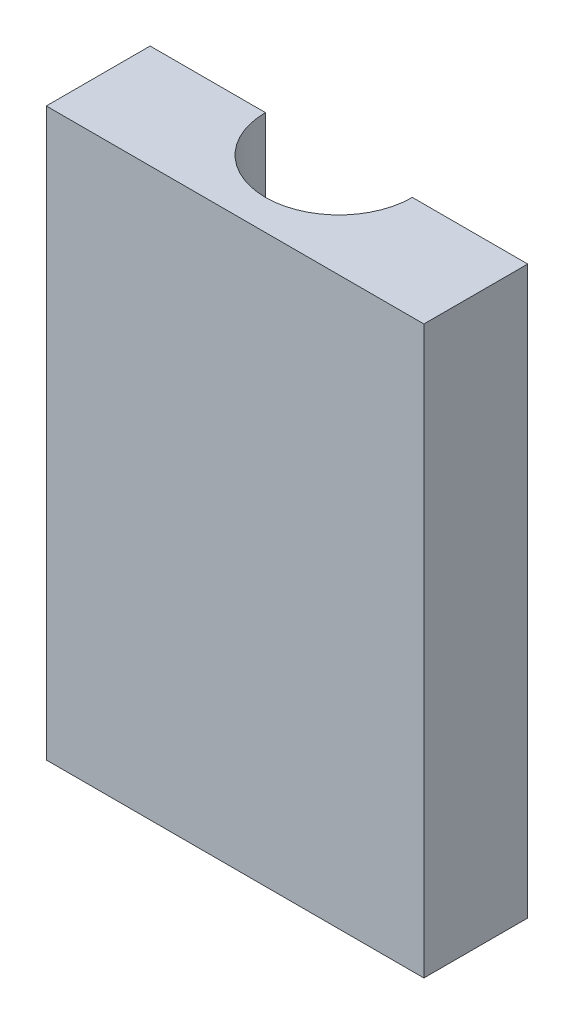
ISO-10303-21;
HEADER;
FILE_DESCRIPTION(('STEP AP214'),'2;1');
FILE_NAME('part.step','',(''),(''),'','','');
FILE_SCHEMA(('AUTOMOTIVE_DESIGN { 1 0 10303 214 1 1 1 1 }'));
ENDSEC;
DATA;
#1=APPLICATION_CONTEXT('core data for automotive mechanical design processes');
#2=APPLICATION_PROTOCOL_DEFINITION('international standard','automotive_design',2000,#1);
#3=PRODUCT_CONTEXT('',#1,'mechanical');
#4=PRODUCT('Part','Part','',(#3));
#5=PRODUCT_RELATED_PRODUCT_CATEGORY('part','',(#4));
#6=PRODUCT_DEFINITION_FORMATION('','',#4);
#7=PRODUCT_DEFINITION_CONTEXT('part definition',#1,'design');
#8=PRODUCT_DEFINITION('design','',#6,#7);
#9=PRODUCT_DEFINITION_SHAPE('','',#8);
#10=(LENGTH_UNIT() NAMED_UNIT(*) SI_UNIT(.MILLI.,.METRE.));
#11=(NAMED_UNIT(*) PLANE_ANGLE_UNIT() SI_UNIT($,.RADIAN.));
#12=(NAMED_UNIT(*) SI_UNIT($,.STERADIAN.) SOLID_ANGLE_UNIT());
#13=UNCERTAINTY_MEASURE_WITH_UNIT(LENGTH_MEASURE(1.E-05),#10,'distance_accuracy_value','');
#14=(GEOMETRIC_REPRESENTATION_CONTEXT(3) GLOBAL_UNCERTAINTY_ASSIGNED_CONTEXT((#13)) GLOBAL_UNIT_ASSIGNED_CONTEXT((#10,
#11,#12)) REPRESENTATION_CONTEXT('',''));
#15=CARTESIAN_POINT('',(0.,0.,0.));
#16=DIRECTION('',(0.,0.,1.));
#17=DIRECTION('',(1.,0.,0.));
#18=AXIS2_PLACEMENT_3D('',#15,#16,#17);
#19=CARTESIAN_POINT('',(-9.8806,12.7,0.));
#20=CARTESIAN_POINT('',(-13.5720666666667,8.46666666666667,0.));
#21=CARTESIAN_POINT('',(-17.2635333333333,4.23333333333333,0.));
#22=CARTESIAN_POINT('',(-20.955,0.,0.));
#23=CARTESIAN_POINT('',(-9.8806,12.7,-0.272662572352311));
#24=CARTESIAN_POINT('',(-13.5720666666667,8.46666666666667,-0.296844728512093));
#25=CARTESIAN_POINT('',(-17.2635333333333,4.23333333333333,-0.321026884671874));
#26=CARTESIAN_POINT('',(-20.955,0.,-0.345209040831655));
#27=CARTESIAN_POINT('',(-9.85846325723523,12.7,-0.812858202586466));
#28=CARTESIAN_POINT('',(-13.5416594698784,8.46666666666667,-0.884949739833852));
#29=CARTESIAN_POINT('',(-17.2248556825215,4.23333333333333,-0.957041277081239));
#30=CARTESIAN_POINT('',(-20.9080518951647,0.,-1.02913281432863));
#31=CARTESIAN_POINT('',(-9.76139899903792,12.7,-1.60521202028217));
#32=CARTESIAN_POINT('',(-13.4083312728858,8.46666666666667,-1.74757658249229));
#33=CARTESIAN_POINT('',(-17.0552635467338,4.23333333333333,-1.8899411447024));
#34=CARTESIAN_POINT('',(-20.7021958205817,0.,-2.03230570691252));
#35=CARTESIAN_POINT('',(-9.60302668103459,12.7,-2.3770751260782));
#36=CARTESIAN_POINT('',(-13.1907898626379,8.46666666666667,-2.58789541360956));
#37=CARTESIAN_POINT('',(-16.7785530442412,4.23333333333333,-2.79871570114091));
#38=CARTESIAN_POINT('',(-20.3663162258446,0.,-3.00953598867227));
#39=CARTESIAN_POINT('',(-8.30025091964339,12.7,-6.87000298399141));
#40=CARTESIAN_POINT('',(-11.4012872529463,8.46666666666667,-7.47929630776443));
#41=CARTESIAN_POINT('',(-14.5023235862492,4.23333333333333,-8.08858963153745));
#42=CARTESIAN_POINT('',(-17.6033599195522,0.,-8.69788295531046));
#43=CARTESIAN_POINT('',(-4.36260115763694,12.7,-9.8806));
#44=CARTESIAN_POINT('',(-5.99250184720824,8.46666666666667,-10.7569));
#45=CARTESIAN_POINT('',(-7.62240253677954,4.23333333333333,-11.6332));
#46=CARTESIAN_POINT('',(-9.25230322635084,0.,-12.5095));
#47=CARTESIAN_POINT('',(5.45325144704619,12.7,-9.8806));
#48=CARTESIAN_POINT('',(7.49062730901031,8.46666666666667,-10.7569));
#49=CARTESIAN_POINT('',(9.52800317097444,4.23333333333333,-11.6332));
#50=CARTESIAN_POINT('',(11.5653790329386,0.,-12.5095));
#51=CARTESIAN_POINT('',(9.8806,12.7,-5.45325144704618));
#52=CARTESIAN_POINT('',(13.5720666666667,8.46666666666667,-5.93689457024179));
#53=CARTESIAN_POINT('',(17.2635333333333,4.23333333333333,-6.4205376934374));
#54=CARTESIAN_POINT('',(20.955,0.,-6.90418081663301));
#55=CARTESIAN_POINT('',(9.8806,12.7,5.45325144704619));
#56=CARTESIAN_POINT('',(13.5720666666667,8.46666666666667,5.9368945702418));
#57=CARTESIAN_POINT('',(17.2635333333333,4.23333333333333,6.42053769343741));
#58=CARTESIAN_POINT('',(20.955,0.,6.90418081663303));
#59=CARTESIAN_POINT('',(5.45325144704618,12.7,9.8806));
#60=CARTESIAN_POINT('',(7.49062730901031,8.46666666666667,10.7569));
#61=CARTESIAN_POINT('',(9.52800317097443,4.23333333333333,11.6332));
#62=CARTESIAN_POINT('',(11.5653790329386,0.,12.5095));
#63=CARTESIAN_POINT('',(-4.36260115763695,12.7,9.8806));
#64=CARTESIAN_POINT('',(-5.99250184720825,8.46666666666667,10.7569));
#65=CARTESIAN_POINT('',(-7.62240253677955,4.23333333333333,11.6332));
#66=CARTESIAN_POINT('',(-9.25230322635085,0.,12.5095));
#67=CARTESIAN_POINT('',(-8.30025091964339,12.7,6.8700029839914));
#68=CARTESIAN_POINT('',(-11.4012872529463,8.46666666666667,7.47929630776442));
#69=CARTESIAN_POINT('',(-14.5023235862493,4.23333333333333,8.08858963153743));
#70=CARTESIAN_POINT('',(-17.6033599195522,0.,8.69788295531045));
#71=CARTESIAN_POINT('',(-9.60302668103459,12.7,2.37707512607819));
#72=CARTESIAN_POINT('',(-13.1907898626379,8.46666666666667,2.58789541360955));
#73=CARTESIAN_POINT('',(-16.7785530442412,4.23333333333333,2.7987157011409));
#74=CARTESIAN_POINT('',(-20.3663162258446,0.,3.00953598867226));
#75=CARTESIAN_POINT('',(-9.76139899903792,12.7,1.60521202028217));
#76=CARTESIAN_POINT('',(-13.4083312728858,8.46666666666667,1.74757658249228));
#77=CARTESIAN_POINT('',(-17.0552635467338,4.23333333333333,1.88994114470239));
#78=CARTESIAN_POINT('',(-20.7021958205817,0.,2.03230570691251));
#79=CARTESIAN_POINT('',(-9.85846325723523,12.7,0.812858202586462));
#80=CARTESIAN_POINT('',(-13.5416594698784,8.46666666666667,0.884949739833847));
#81=CARTESIAN_POINT('',(-17.2248556825215,4.23333333333333,0.957041277081232));
#82=CARTESIAN_POINT('',(-20.9080518951647,0.,1.02913281432862));
#83=CARTESIAN_POINT('',(-9.8806,12.7,0.272662572352305));
#84=CARTESIAN_POINT('',(-13.5720666666667,8.46666666666667,0.296844728512085));
#85=CARTESIAN_POINT('',(-17.2635333333333,4.23333333333333,0.321026884671864));
#86=CARTESIAN_POINT('',(-20.955,0.,0.345209040831644));
#87=CARTESIAN_POINT('',(-9.8806,12.7,0.));
#88=CARTESIAN_POINT('',(-13.5720666666667,8.46666666666667,0.));
#89=CARTESIAN_POINT('',(-17.2635333333333,4.23333333333333,0.));
#90=CARTESIAN_POINT('',(-20.955,0.,0.));
#91=B_SPLINE_SURFACE_WITH_KNOTS('',3,3,((#19,#20,#21,#22),(#23,#24,#25,#26),(#27,#28,#29,#30),
(#31,#32,#33,#34),(#35,#36,#37,#38),(#39,#40,#41,#42),(#43,#44,#45,#46),(#47,#48,#49,#50),(#51,
#52,#53,#54),(#55,#56,#57,#58),(#59,#60,#61,#62),(#63,#64,#65,#66),(#67,#68,#69,#70),(#71,#72,
#73,#74),(#75,#76,#77,#78),(#79,#80,#81,#82),(#83,#84,#85,#86),(#87,#88,#89,#90)),.UNSPECIFIED.,
.T.,.F.,.F.,(4,1,1,1,1,2,2,2,1,1,1,1,4),(4,4),(0.,0.0125,0.0249999999999999,0.0375000000000001,
0.05,0.25,0.5,0.75,0.95,0.9625,0.975,0.9875,1.),(0.,1.),.UNSPECIFIED.);
#92=CARTESIAN_POINT('',(20.955,0.,0.));
#93=CARTESIAN_POINT('',(19.1092666666667,2.11666666666666,0.));
#94=CARTESIAN_POINT('',(17.2635333333333,4.23333333333333,0.));
#95=CARTESIAN_POINT('',(13.5720666666667,8.46666666666666,0.));
#96=CARTESIAN_POINT('',(11.7263333333333,10.5833333333333,0.));
#97=CARTESIAN_POINT('',(9.8806,12.7,0.));
#98=B_SPLINE_CURVE_WITH_KNOTS('',3,(#92,#93,#94,#95,#96,#97),.UNSPECIFIED.,.F.,.F.,(4,2,4),(0.,
8.42514592395883,16.8502918479176),.UNSPECIFIED.);
#99=CARTESIAN_POINT('',(20.955,0.,0.));
#100=VERTEX_POINT('',#99);
#101=CARTESIAN_POINT('',(9.8806,12.7,0.));
#102=VERTEX_POINT('',#101);
#103=EDGE_CURVE('E166',#100,#102,#98,.T.);
#104=CARTESIAN_POINT('',(0.,0.,0.));
#105=DIRECTION('',(0.,1.,0.));
#106=DIRECTION('',(-1.,0.,0.));
#107=AXIS2_PLACEMENT_3D('',#104,#105,#106);
#108=ELLIPSE('',#107,20.955,12.5095);
#109=CARTESIAN_POINT('',(-20.955,0.,0.));
#110=VERTEX_POINT('',#109);
#111=EDGE_CURVE('E237',#110,#100,#108,.T.);
#112=DIRECTION('',(-0.657223038031152,-0.753696144531139,0.));
#113=VECTOR('',#112,1.);
#114=CARTESIAN_POINT('',(-15.4178,6.35,0.));
#115=LINE('',#114,#113);
#116=CARTESIAN_POINT('',(-9.8806,12.7,0.));
#117=VERTEX_POINT('',#116);
#118=EDGE_CURVE('E174',#117,#110,#115,.T.);
#119=CARTESIAN_POINT('',(-9.8806,12.7,0.));
#120=CARTESIAN_POINT('',(-9.8806,12.7,0.272662572352305));
#121=CARTESIAN_POINT('',(-9.85846325723523,12.7,0.812858202586462));
#122=CARTESIAN_POINT('',(-9.76139899903792,12.7,1.60521202028217));
#123=CARTESIAN_POINT('',(-9.60302668103459,12.7,2.37707512607819));
#124=CARTESIAN_POINT('',(-8.30025091964339,12.7,6.8700029839914));
#125=CARTESIAN_POINT('',(-4.36260115763695,12.7,9.8806));
#126=CARTESIAN_POINT('',(5.45325144704618,12.7,9.8806));
#127=CARTESIAN_POINT('',(9.8806,12.7,5.45325144704619));
#128=CARTESIAN_POINT('',(9.8806,12.7,-5.45325144704618));
#129=CARTESIAN_POINT('',(5.45325144704619,12.7,-9.8806));
#130=CARTESIAN_POINT('',(-4.36260115763694,12.7,-9.8806));
#131=CARTESIAN_POINT('',(-8.30025091964339,12.7,-6.87000298399141));
#132=CARTESIAN_POINT('',(-9.60302668103459,12.7,-2.3770751260782));
#133=CARTESIAN_POINT('',(-9.76139899903792,12.7,-1.60521202028217));
#134=CARTESIAN_POINT('',(-9.85846325723523,12.7,-0.812858202586466));
#135=CARTESIAN_POINT('',(-9.8806,12.7,-0.272662572352311));
#136=CARTESIAN_POINT('',(-9.8806,12.7,0.));
#137=B_SPLINE_CURVE_WITH_KNOTS('',3,(#119,#120,#121,#122,#123,#124,#125,#126,#127,#128,#129,
#130,#131,#132,#133,#134,#135,#136),.UNSPECIFIED.,.T.,.F.,(4,1,1,1,1,2,2,2,1,1,1,1,4),(0.,
0.0125,0.025,0.0375,0.05,0.25,0.5,0.75,0.95,0.9625,0.975,0.9875,1.),.UNSPECIFIED.);
#138=EDGE_CURVE('E172',#117,#102,#137,.T.);
#139=CARTESIAN_POINT('',(0.,12.7,-9.8806));
#140=CARTESIAN_POINT('',(0.,8.46666666666666,-10.7569));
#141=CARTESIAN_POINT('',(0.,4.23333333333333,-11.6332));
#142=CARTESIAN_POINT('',(0.,0.,-12.5095));
#143=CARTESIAN_POINT('',(5.45325144704619,12.7,-9.8806));
#144=CARTESIAN_POINT('',(7.49062730901031,8.46666666666667,-10.7569));
#145=CARTESIAN_POINT('',(9.52800317097444,4.23333333333333,-11.6332));
#146=CARTESIAN_POINT('',(11.5653790329386,0.,-12.5095));
#147=CARTESIAN_POINT('',(9.8806,12.7,-5.45325144704618));
#148=CARTESIAN_POINT('',(13.5720666666667,8.46666666666667,-5.93689457024179));
#149=CARTESIAN_POINT('',(17.2635333333333,4.23333333333333,-6.4205376934374));
#150=CARTESIAN_POINT('',(20.955,0.,-6.90418081663301));
#151=CARTESIAN_POINT('',(9.8806,12.7,5.45325144704619));
#152=CARTESIAN_POINT('',(13.5720666666667,8.46666666666667,5.9368945702418));
#153=CARTESIAN_POINT('',(17.2635333333333,4.23333333333333,6.42053769343741));
#154=CARTESIAN_POINT('',(20.955,0.,6.90418081663303));
#155=CARTESIAN_POINT('',(5.45325144704618,12.7,9.8806));
#156=CARTESIAN_POINT('',(7.49062730901031,8.46666666666667,10.7569));
#157=CARTESIAN_POINT('',(9.52800317097443,4.23333333333333,11.6332));
#158=CARTESIAN_POINT('',(11.5653790329386,0.,12.5095));
#159=CARTESIAN_POINT('',(-4.36260115763695,12.7,9.8806));
#160=CARTESIAN_POINT('',(-5.99250184720825,8.46666666666667,10.7569));
#161=CARTESIAN_POINT('',(-7.62240253677955,4.23333333333333,11.6332));
#162=CARTESIAN_POINT('',(-9.25230322635085,0.,12.5095));
#163=CARTESIAN_POINT('',(-8.30025091964339,12.7,6.8700029839914));
#164=CARTESIAN_POINT('',(-11.4012872529463,8.46666666666667,7.47929630776442));
#165=CARTESIAN_POINT('',(-14.5023235862493,4.23333333333333,8.08858963153743));
#166=CARTESIAN_POINT('',(-17.6033599195522,0.,8.69788295531045));
#167=CARTESIAN_POINT('',(-9.60302668103459,12.7,2.37707512607819));
#168=CARTESIAN_POINT('',(-13.1907898626379,8.46666666666667,2.58789541360955));
#169=CARTESIAN_POINT('',(-16.7785530442412,4.23333333333333,2.7987157011409));
#170=CARTESIAN_POINT('',(-20.3663162258446,0.,3.00953598867226));
#171=CARTESIAN_POINT('',(-9.76139899903792,12.7,1.60521202028217));
#172=CARTESIAN_POINT('',(-13.4083312728858,8.46666666666667,1.74757658249228));
#173=CARTESIAN_POINT('',(-17.0552635467338,4.23333333333333,1.88994114470239));
#174=CARTESIAN_POINT('',(-20.7021958205817,0.,2.03230570691251));
#175=CARTESIAN_POINT('',(-9.85846325723523,12.7,0.812858202586462));
#176=CARTESIAN_POINT('',(-13.5416594698784,8.46666666666667,0.884949739833847));
#177=CARTESIAN_POINT('',(-17.2248556825215,4.23333333333333,0.957041277081232));
#178=CARTESIAN_POINT('',(-20.9080518951647,0.,1.02913281432862));
#179=CARTESIAN_POINT('',(-9.8806,12.7,0.272662572352305));
#180=CARTESIAN_POINT('',(-13.5720666666667,8.46666666666667,0.296844728512085));
#181=CARTESIAN_POINT('',(-17.2635333333333,4.23333333333333,0.321026884671864));
#182=CARTESIAN_POINT('',(-20.955,0.,0.345209040831644));
#183=CARTESIAN_POINT('',(-9.8806,12.7,0.));
#184=CARTESIAN_POINT('',(-13.5720666666667,8.46666666666667,0.));
#185=CARTESIAN_POINT('',(-17.2635333333333,4.23333333333333,0.));
#186=CARTESIAN_POINT('',(-20.955,0.,0.));
#187=CARTESIAN_POINT('',(-9.8806,12.7,-0.272662572352311));
#188=CARTESIAN_POINT('',(-13.5720666666667,8.46666666666667,-0.296844728512093));
#189=CARTESIAN_POINT('',(-17.2635333333333,4.23333333333333,-0.321026884671874));
#190=CARTESIAN_POINT('',(-20.955,0.,-0.345209040831655));
#191=CARTESIAN_POINT('',(-9.85846325723523,12.7,-0.812858202586466));
#192=CARTESIAN_POINT('',(-13.5416594698784,8.46666666666667,-0.884949739833852));
#193=CARTESIAN_POINT('',(-17.2248556825215,4.23333333333333,-0.957041277081239));
#194=CARTESIAN_POINT('',(-20.9080518951647,0.,-1.02913281432863));
#195=CARTESIAN_POINT('',(-9.76139899903792,12.7,-1.60521202028217));
#196=CARTESIAN_POINT('',(-13.4083312728858,8.46666666666667,-1.74757658249229));
#197=CARTESIAN_POINT('',(-17.0552635467338,4.23333333333333,-1.8899411447024));
#198=CARTESIAN_POINT('',(-20.7021958205817,0.,-2.03230570691252));
#199=CARTESIAN_POINT('',(-9.60302668103459,12.7,-2.3770751260782));
#200=CARTESIAN_POINT('',(-13.1907898626379,8.46666666666667,-2.58789541360956));
#201=CARTESIAN_POINT('',(-16.7785530442412,4.23333333333333,-2.79871570114091));
#202=CARTESIAN_POINT('',(-20.3663162258446,0.,-3.00953598867227));
#203=CARTESIAN_POINT('',(-8.30025091964339,12.7,-6.87000298399141));
#204=CARTESIAN_POINT('',(-11.4012872529463,8.46666666666667,-7.47929630776443));
#205=CARTESIAN_POINT('',(-14.5023235862492,4.23333333333333,-8.08858963153745));
#206=CARTESIAN_POINT('',(-17.6033599195522,0.,-8.69788295531046));
#207=CARTESIAN_POINT('',(-4.36260115763694,12.7,-9.8806));
#208=CARTESIAN_POINT('',(-5.99250184720824,8.46666666666667,-10.7569));
#209=CARTESIAN_POINT('',(-7.62240253677954,4.23333333333333,-11.6332));
#210=CARTESIAN_POINT('',(-9.25230322635084,0.,-12.5095));
#211=CARTESIAN_POINT('',(0.,12.7,-9.8806));
#212=CARTESIAN_POINT('',(0.,8.46666666666666,-10.7569));
#213=CARTESIAN_POINT('',(0.,4.23333333333333,-11.6332));
#214=CARTESIAN_POINT('',(0.,0.,-12.5095));
#215=B_SPLINE_SURFACE_WITH_KNOTS('',3,3,((#139,#140,#141,#142),(#143,#144,#145,#146),(#147,#148,
#149,#150),(#151,#152,#153,#154),(#155,#156,#157,#158),(#159,#160,#161,#162),(#163,#164,#165,
#166),(#167,#168,#169,#170),(#171,#172,#173,#174),(#175,#176,#177,#178),(#179,#180,#181,#182),
(#183,#184,#185,#186),(#187,#188,#189,#190),(#191,#192,#193,#194),(#195,#196,#197,#198),(#199,
#200,#201,#202),(#203,#204,#205,#206),(#207,#208,#209,#210),(#211,#212,#213,#214)),
.UNSPECIFIED.,.T.,.F.,.F.,(4,2,2,1,1,1,1,3,1,1,1,1,4),(4,4),(0.25,0.5,0.75,0.95,0.9625,0.975,
0.9875,1.,1.0125,1.025,1.0375,1.05,1.25),(0.,1.),.UNSPECIFIED.);
#216=ORIENTED_EDGE('',*,*,#103,.F.);
#217=ORIENTED_EDGE('',*,*,#111,.F.);
#218=ORIENTED_EDGE('',*,*,#118,.F.);
#219=ORIENTED_EDGE('',*,*,#138,.T.);
#220=EDGE_LOOP('',(#216,#217,#218,#219));
#221=FACE_BOUND('',#220,.T.);
#222=ADVANCED_FACE('F53',(#221),#215,.F.);
#223=CARTESIAN_POINT('',(25.4,-50.8,13.97));
#224=DIRECTION('',(-1.,0.,0.));
#225=DIRECTION('',(0.,0.,1.));
#226=AXIS2_PLACEMENT_3D('',#223,#224,#225);
#227=PLANE('',#226);
#228=DIRECTION('',(0.,-1.,0.));
#229=VECTOR('',#228,1.);
#230=CARTESIAN_POINT('',(25.4,0.,0.));
#231=LINE('',#230,#229);
#232=CARTESIAN_POINT('',(25.4,25.4,0.));
#233=VERTEX_POINT('',#232);
#234=CARTESIAN_POINT('',(25.4,-50.8,0.));
#235=VERTEX_POINT('',#234);
#236=EDGE_CURVE('E151',#233,#235,#231,.T.);
#237=ORIENTED_EDGE('',*,*,#236,.F.);
#238=DIRECTION('',(0.,0.,-1.));
#239=VECTOR('',#238,1.);
#240=CARTESIAN_POINT('',(25.4,25.4,13.97));
#241=LINE('',#240,#239);
#242=CARTESIAN_POINT('',(25.4,25.4,13.97));
#243=VERTEX_POINT('',#242);
#244=EDGE_CURVE('E70',#243,#233,#241,.T.);
#245=ORIENTED_EDGE('',*,*,#244,.F.);
#246=DIRECTION('',(0.,1.,0.));
#247=VECTOR('',#246,1.);
#248=CARTESIAN_POINT('',(25.4,-50.8,13.97));
#249=LINE('',#248,#247);
#250=CARTESIAN_POINT('',(25.4,-50.8,13.97));
#251=VERTEX_POINT('',#250);
#252=EDGE_CURVE('E136',#251,#243,#249,.T.);
#253=ORIENTED_EDGE('',*,*,#252,.F.);
#254=DIRECTION('',(0.,0.,-1.));
#255=VECTOR('',#254,1.);
#256=CARTESIAN_POINT('',(25.4,-50.8,13.97));
#257=LINE('',#256,#255);
#258=EDGE_CURVE('E63',#251,#235,#257,.T.);
#259=ORIENTED_EDGE('',*,*,#258,.T.);
#260=EDGE_LOOP('',(#237,#245,#253,#259));
#261=FACE_BOUND('',#260,.T.);
#262=ADVANCED_FACE('F55',(#261),#227,.F.);
#263=CARTESIAN_POINT('',(-25.4,-50.8,13.97));
#264=DIRECTION('',(1.,0.,0.));
#265=DIRECTION('',(0.,0.,-1.));
#266=AXIS2_PLACEMENT_3D('',#263,#264,#265);
#267=PLANE('',#266);
#268=DIRECTION('',(0.,-1.,0.));
#269=VECTOR('',#268,1.);
#270=CARTESIAN_POINT('',(-25.4,-50.8,13.97));
#271=LINE('',#270,#269);
#272=CARTESIAN_POINT('',(-25.4,25.4,13.97));
#273=VERTEX_POINT('',#272);
#274=CARTESIAN_POINT('',(-25.4,-50.8,13.97));
#275=VERTEX_POINT('',#274);
#276=EDGE_CURVE('E133',#273,#275,#271,.T.);
#277=ORIENTED_EDGE('',*,*,#276,.F.);
#278=DIRECTION('',(0.,0.,1.));
#279=VECTOR('',#278,1.);
#280=CARTESIAN_POINT('',(-25.4,25.4,13.97));
#281=LINE('',#280,#279);
#282=CARTESIAN_POINT('',(-25.4,25.4,0.));
#283=VERTEX_POINT('',#282);
#284=EDGE_CURVE('E119',#283,#273,#281,.T.);
#285=ORIENTED_EDGE('',*,*,#284,.F.);
#286=DIRECTION('',(0.,1.,0.));
#287=VECTOR('',#286,1.);
#288=CARTESIAN_POINT('',(-25.4,0.,0.));
#289=LINE('',#288,#287);
#290=CARTESIAN_POINT('',(-25.4,-50.8,0.));
#291=VERTEX_POINT('',#290);
#292=EDGE_CURVE('E169',#291,#283,#289,.T.);
#293=ORIENTED_EDGE('',*,*,#292,.F.);
#294=DIRECTION('',(0.,0.,-1.));
#295=VECTOR('',#294,1.);
#296=CARTESIAN_POINT('',(-25.4,-50.8,13.97));
#297=LINE('',#296,#295);
#298=EDGE_CURVE('E13',#275,#291,#297,.T.);
#299=ORIENTED_EDGE('',*,*,#298,.F.);
#300=EDGE_LOOP('',(#277,#285,#293,#299));
#301=FACE_BOUND('',#300,.T.);
#302=ADVANCED_FACE('F138',(#301),#267,.F.);
#303=CARTESIAN_POINT('',(-25.4,-50.8,13.97));
#304=DIRECTION('',(0.,1.,0.));
#305=DIRECTION('',(0.,0.,1.));
#306=AXIS2_PLACEMENT_3D('',#303,#304,#305);
#307=PLANE('',#306);
#308=CARTESIAN_POINT('',(0.,-50.8,0.));
#309=DIRECTION('',(0.,1.,0.));
#310=DIRECTION('',(-1.,0.,0.));
#311=AXIS2_PLACEMENT_3D('',#308,#309,#310);
#312=ELLIPSE('',#311,20.955,12.5095);
#313=CARTESIAN_POINT('',(-20.955,-50.8,0.));
#314=VERTEX_POINT('',#313);
#315=CARTESIAN_POINT('',(20.955,-50.8,0.));
#316=VERTEX_POINT('',#315);
#317=EDGE_CURVE('E143',#314,#316,#312,.T.);
#318=ORIENTED_EDGE('',*,*,#317,.T.);
#319=DIRECTION('',(-1.,0.,0.));
#320=VECTOR('',#319,1.);
#321=CARTESIAN_POINT('',(0.,-50.8,0.));
#322=LINE('',#321,#320);
#323=EDGE_CURVE('E156',#235,#316,#322,.T.);
#324=ORIENTED_EDGE('',*,*,#323,.F.);
#325=ORIENTED_EDGE('',*,*,#258,.F.);
#326=DIRECTION('',(1.,0.,0.));
#327=VECTOR('',#326,1.);
#328=CARTESIAN_POINT('',(-25.4,-50.8,13.97));
#329=LINE('',#328,#327);
#330=EDGE_CURVE('E140',#275,#251,#329,.T.);
#331=ORIENTED_EDGE('',*,*,#330,.F.);
#332=ORIENTED_EDGE('',*,*,#298,.T.);
#333=EDGE_CURVE('E163',#314,#291,#322,.T.);
#334=ORIENTED_EDGE('',*,*,#333,.F.);
#335=EDGE_LOOP('',(#318,#324,#325,#331,#332,#334));
#336=FACE_BOUND('',#335,.T.);
#337=ADVANCED_FACE('F155',(#336),#307,.F.);
#338=CARTESIAN_POINT('',(0.,0.,13.97));
#339=DIRECTION('',(0.,0.,-1.));
#340=DIRECTION('',(-1.,0.,0.));
#341=AXIS2_PLACEMENT_3D('',#338,#339,#340);
#342=PLANE('',#341);
#343=ORIENTED_EDGE('',*,*,#252,.T.);
#344=DIRECTION('',(1.,0.,0.));
#345=VECTOR('',#344,1.);
#346=CARTESIAN_POINT('',(-25.4,25.4,13.97));
#347=LINE('',#346,#345);
#348=EDGE_CURVE('E122',#273,#243,#347,.T.);
#349=ORIENTED_EDGE('',*,*,#348,.F.);
#350=ORIENTED_EDGE('',*,*,#276,.T.);
#351=ORIENTED_EDGE('',*,*,#330,.T.);
#352=EDGE_LOOP('',(#343,#349,#350,#351));
#353=FACE_BOUND('',#352,.T.);
#354=ADVANCED_FACE('F132',(#353),#342,.F.);
#355=DIRECTION('',(0.,1.,0.));
#356=VECTOR('',#355,1.);
#357=SURFACE_OF_LINEAR_EXTRUSION('',#312,#356);
#358=ORIENTED_EDGE('',*,*,#111,.T.);
#359=DIRECTION('',(0.,1.,0.));
#360=VECTOR('',#359,1.);
#361=CARTESIAN_POINT('',(20.955,-50.8,0.));
#362=LINE('',#361,#360);
#363=EDGE_CURVE('E161',#316,#100,#362,.T.);
#364=ORIENTED_EDGE('',*,*,#363,.F.);
#365=ORIENTED_EDGE('',*,*,#317,.F.);
#366=DIRECTION('',(0.,1.,0.));
#367=VECTOR('',#366,1.);
#368=CARTESIAN_POINT('',(-20.955,-50.8,0.));
#369=LINE('',#368,#367);
#370=EDGE_CURVE('E170',#110,#314,#369,.F.);
#371=ORIENTED_EDGE('',*,*,#370,.F.);
#372=EDGE_LOOP('',(#358,#364,#365,#371));
#373=FACE_BOUND('',#372,.T.);
#374=ADVANCED_FACE('F203',(#373),#357,.F.);
#375=CARTESIAN_POINT('',(0.,50.8,0.));
#376=DIRECTION('',(0.,-1.,0.));
#377=DIRECTION('',(0.,0.,-1.));
#378=AXIS2_PLACEMENT_3D('',#375,#376,#377);
#379=CYLINDRICAL_SURFACE('',#378,9.8806);
#380=CARTESIAN_POINT('',(0.,25.4,0.));
#381=DIRECTION('',(0.,-1.,0.));
#382=DIRECTION('',(0.,0.,-1.));
#383=AXIS2_PLACEMENT_3D('',#380,#381,#382);
#384=CIRCLE('',#383,9.8806);
#385=CARTESIAN_POINT('',(9.8806,25.4,0.));
#386=VERTEX_POINT('',#385);
#387=CARTESIAN_POINT('',(-9.8806,25.4,0.));
#388=VERTEX_POINT('',#387);
#389=EDGE_CURVE('E247',#386,#388,#384,.T.);
#390=ORIENTED_EDGE('',*,*,#389,.F.);
#391=DIRECTION('',(0.,-1.,0.));
#392=VECTOR('',#391,1.);
#393=CARTESIAN_POINT('',(9.8806,50.8,0.));
#394=LINE('',#393,#392);
#395=EDGE_CURVE('E57',#386,#102,#394,.T.);
#396=ORIENTED_EDGE('',*,*,#395,.T.);
#397=ORIENTED_EDGE('',*,*,#138,.F.);
#398=DIRECTION('',(0.,-1.,0.));
#399=VECTOR('',#398,1.);
#400=CARTESIAN_POINT('',(-9.8806,50.8,0.));
#401=LINE('',#400,#399);
#402=EDGE_CURVE('E164',#117,#388,#401,.F.);
#403=ORIENTED_EDGE('',*,*,#402,.T.);
#404=EDGE_LOOP('',(#390,#396,#397,#403));
#405=FACE_BOUND('',#404,.T.);
#406=ADVANCED_FACE('F192',(#405),#379,.F.);
#407=CARTESIAN_POINT('',(0.,0.,0.));
#408=DIRECTION('',(0.,0.,1.));
#409=DIRECTION('',(1.,0.,0.));
#410=AXIS2_PLACEMENT_3D('',#407,#408,#409);
#411=PLANE('',#410);
#412=ORIENTED_EDGE('',*,*,#292,.T.);
#413=DIRECTION('',(-1.,0.,0.));
#414=VECTOR('',#413,1.);
#415=CARTESIAN_POINT('',(-25.4,25.4,0.));
#416=LINE('',#415,#414);
#417=EDGE_CURVE('E124',#388,#283,#416,.T.);
#418=ORIENTED_EDGE('',*,*,#417,.F.);
#419=ORIENTED_EDGE('',*,*,#402,.F.);
#420=ORIENTED_EDGE('',*,*,#118,.T.);
#421=ORIENTED_EDGE('',*,*,#370,.T.);
#422=ORIENTED_EDGE('',*,*,#333,.T.);
#423=EDGE_LOOP('',(#412,#418,#419,#420,#421,#422));
#424=FACE_BOUND('',#423,.T.);
#425=ADVANCED_FACE('F202',(#424),#411,.F.);
#426=ORIENTED_EDGE('',*,*,#395,.F.);
#427=EDGE_CURVE('E333',#233,#386,#416,.T.);
#428=ORIENTED_EDGE('',*,*,#427,.F.);
#429=ORIENTED_EDGE('',*,*,#236,.T.);
#430=ORIENTED_EDGE('',*,*,#323,.T.);
#431=ORIENTED_EDGE('',*,*,#363,.T.);
#432=ORIENTED_EDGE('',*,*,#103,.T.);
#433=EDGE_LOOP('',(#426,#428,#429,#430,#431,#432));
#434=FACE_BOUND('',#433,.T.);
#435=ADVANCED_FACE('F245',(#434),#411,.F.);
#436=CARTESIAN_POINT('',(0.,25.4,0.));
#437=DIRECTION('',(0.,-1.,0.));
#438=DIRECTION('',(0.,0.,-1.));
#439=AXIS2_PLACEMENT_3D('',#436,#437,#438);
#440=PLANE('',#439);
#441=ORIENTED_EDGE('',*,*,#389,.T.);
#442=ORIENTED_EDGE('',*,*,#417,.T.);
#443=ORIENTED_EDGE('',*,*,#284,.T.);
#444=ORIENTED_EDGE('',*,*,#348,.T.);
#445=ORIENTED_EDGE('',*,*,#244,.T.);
#446=ORIENTED_EDGE('',*,*,#427,.T.);
#447=EDGE_LOOP('',(#441,#442,#443,#444,#445,#446));
#448=FACE_BOUND('',#447,.T.);
#449=ADVANCED_FACE('F121',(#448),#440,.F.);
#450=CLOSED_SHELL('',(#222,#262,#302,#337,#354,#374,#406,#425,#435,#449));
#451=MANIFOLD_SOLID_BREP('B2',#450);
#452=ADVANCED_BREP_SHAPE_REPRESENTATION('',(#18,#451),#14);
#453=SHAPE_DEFINITION_REPRESENTATION(#9,#452);
ENDSEC;
END-ISO-10303-21;
